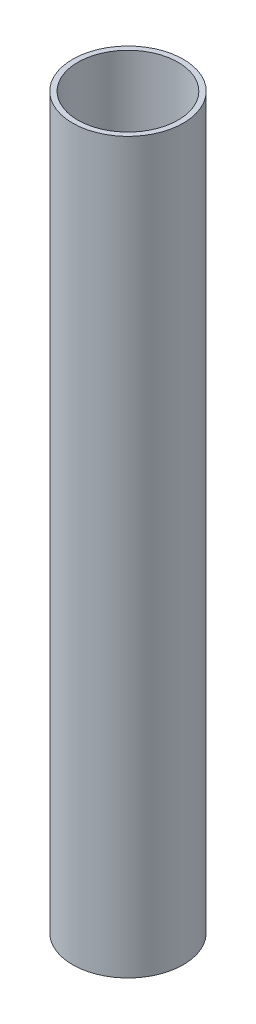
ISO-10303-21;
HEADER;
FILE_DESCRIPTION(('STEP AP214'),'2;1');
FILE_NAME('part.step','',(''),(''),'','','');
FILE_SCHEMA(('AUTOMOTIVE_DESIGN { 1 0 10303 214 1 1 1 1 }'));
ENDSEC;
DATA;
#1=APPLICATION_CONTEXT('core data for automotive mechanical design processes');
#2=APPLICATION_PROTOCOL_DEFINITION('international standard','automotive_design',2000,#1);
#3=PRODUCT_CONTEXT('',#1,'mechanical');
#4=PRODUCT('Part','Part','',(#3));
#5=PRODUCT_RELATED_PRODUCT_CATEGORY('part','',(#4));
#6=PRODUCT_DEFINITION_FORMATION('','',#4);
#7=PRODUCT_DEFINITION_CONTEXT('part definition',#1,'design');
#8=PRODUCT_DEFINITION('design','',#6,#7);
#9=PRODUCT_DEFINITION_SHAPE('','',#8);
#10=(LENGTH_UNIT() NAMED_UNIT(*) SI_UNIT(.MILLI.,.METRE.));
#11=(NAMED_UNIT(*) PLANE_ANGLE_UNIT() SI_UNIT($,.RADIAN.));
#12=(NAMED_UNIT(*) SI_UNIT($,.STERADIAN.) SOLID_ANGLE_UNIT());
#13=UNCERTAINTY_MEASURE_WITH_UNIT(LENGTH_MEASURE(1.E-05),#10,'distance_accuracy_value','');
#14=(GEOMETRIC_REPRESENTATION_CONTEXT(3) GLOBAL_UNCERTAINTY_ASSIGNED_CONTEXT((#13)) GLOBAL_UNIT_ASSIGNED_CONTEXT((#10,
#11,#12)) REPRESENTATION_CONTEXT('',''));
#15=CARTESIAN_POINT('',(0.,0.,0.));
#16=DIRECTION('',(0.,0.,1.));
#17=DIRECTION('',(1.,0.,0.));
#18=AXIS2_PLACEMENT_3D('',#15,#16,#17);
#19=CARTESIAN_POINT('',(0.,355.6,0.));
#20=DIRECTION('',(0.,1.,0.));
#21=DIRECTION('',(0.,0.,1.));
#22=AXIS2_PLACEMENT_3D('',#19,#20,#21);
#23=PLANE('',#22);
#24=CARTESIAN_POINT('',(0.,355.6,0.));
#25=DIRECTION('',(0.,1.,0.));
#26=DIRECTION('',(0.,0.,1.));
#27=AXIS2_PLACEMENT_3D('',#24,#25,#26);
#28=CIRCLE('',#27,27.);
#29=CARTESIAN_POINT('',(0.,355.6,27.));
#30=VERTEX_POINT('',#29);
#31=EDGE_CURVE('E10',#30,#30,#28,.T.);
#32=ORIENTED_EDGE('',*,*,#31,.T.);
#33=EDGE_LOOP('',(#32));
#34=FACE_BOUND('',#33,.T.);
#35=CARTESIAN_POINT('',(0.,355.6,0.));
#36=DIRECTION('',(0.,1.,0.));
#37=DIRECTION('',(0.,0.,1.));
#38=AXIS2_PLACEMENT_3D('',#35,#36,#37);
#39=CIRCLE('',#38,24.46);
#40=CARTESIAN_POINT('',(0.,355.6,24.46));
#41=VERTEX_POINT('',#40);
#42=EDGE_CURVE('E41',#41,#41,#39,.T.);
#43=ORIENTED_EDGE('',*,*,#42,.F.);
#44=EDGE_LOOP('',(#43));
#45=FACE_BOUND('',#44,.T.);
#46=ADVANCED_FACE('F30',(#34,#45),#23,.T.);
#47=CARTESIAN_POINT('',(0.,0.,0.));
#48=DIRECTION('',(0.,1.,0.));
#49=DIRECTION('',(0.,0.,1.));
#50=AXIS2_PLACEMENT_3D('',#47,#48,#49);
#51=PLANE('',#50);
#52=CARTESIAN_POINT('',(0.,0.,0.));
#53=DIRECTION('',(0.,1.,0.));
#54=DIRECTION('',(0.,0.,1.));
#55=AXIS2_PLACEMENT_3D('',#52,#53,#54);
#56=CIRCLE('',#55,27.);
#57=CARTESIAN_POINT('',(0.,0.,27.));
#58=VERTEX_POINT('',#57);
#59=EDGE_CURVE('E34',#58,#58,#56,.T.);
#60=ORIENTED_EDGE('',*,*,#59,.F.);
#61=EDGE_LOOP('',(#60));
#62=FACE_BOUND('',#61,.T.);
#63=CARTESIAN_POINT('',(0.,0.,0.));
#64=DIRECTION('',(0.,1.,0.));
#65=DIRECTION('',(0.,0.,1.));
#66=AXIS2_PLACEMENT_3D('',#63,#64,#65);
#67=CIRCLE('',#66,24.46);
#68=CARTESIAN_POINT('',(0.,0.,24.46));
#69=VERTEX_POINT('',#68);
#70=EDGE_CURVE('E43',#69,#69,#67,.T.);
#71=ORIENTED_EDGE('',*,*,#70,.T.);
#72=EDGE_LOOP('',(#71));
#73=FACE_BOUND('',#72,.T.);
#74=ADVANCED_FACE('F53',(#62,#73),#51,.F.);
#75=CARTESIAN_POINT('',(0.,355.6,0.));
#76=DIRECTION('',(0.,-1.,0.));
#77=DIRECTION('',(0.,0.,-1.));
#78=AXIS2_PLACEMENT_3D('',#75,#76,#77);
#79=CYLINDRICAL_SURFACE('',#78,27.);
#80=ORIENTED_EDGE('',*,*,#31,.F.);
#81=EDGE_LOOP('',(#80));
#82=FACE_BOUND('',#81,.T.);
#83=ORIENTED_EDGE('',*,*,#59,.T.);
#84=EDGE_LOOP('',(#83));
#85=FACE_BOUND('',#84,.T.);
#86=ADVANCED_FACE('F32',(#82,#85),#79,.T.);
#87=CARTESIAN_POINT('',(0.,355.6,0.));
#88=DIRECTION('',(0.,-1.,0.));
#89=DIRECTION('',(0.,0.,-1.));
#90=AXIS2_PLACEMENT_3D('',#87,#88,#89);
#91=CYLINDRICAL_SURFACE('',#90,24.46);
#92=ORIENTED_EDGE('',*,*,#42,.T.);
#93=EDGE_LOOP('',(#92));
#94=FACE_BOUND('',#93,.T.);
#95=ORIENTED_EDGE('',*,*,#70,.F.);
#96=EDGE_LOOP('',(#95));
#97=FACE_BOUND('',#96,.T.);
#98=ADVANCED_FACE('F49',(#94,#97),#91,.F.);
#99=CLOSED_SHELL('',(#46,#74,#86,#98));
#100=MANIFOLD_SOLID_BREP('B2',#99);
#101=ADVANCED_BREP_SHAPE_REPRESENTATION('',(#18,#100),#14);
#102=SHAPE_DEFINITION_REPRESENTATION(#9,#101);
ENDSEC;
END-ISO-10303-21;
